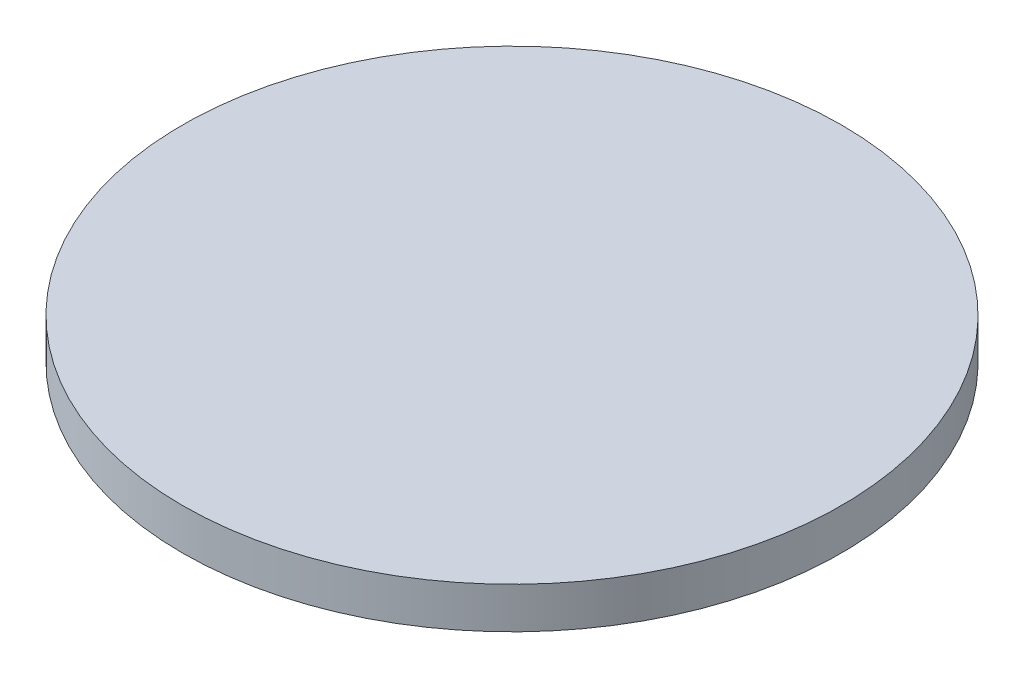
ISO-10303-21;
HEADER;
FILE_DESCRIPTION(('STEP AP214'),'2;1');
FILE_NAME('part.step','',(''),(''),'','','');
FILE_SCHEMA(('AUTOMOTIVE_DESIGN { 1 0 10303 214 1 1 1 1 }'));
ENDSEC;
DATA;
#1=APPLICATION_CONTEXT('core data for automotive mechanical design processes');
#2=APPLICATION_PROTOCOL_DEFINITION('international standard','automotive_design',2000,#1);
#3=PRODUCT_CONTEXT('',#1,'mechanical');
#4=PRODUCT('Part','Part','',(#3));
#5=PRODUCT_RELATED_PRODUCT_CATEGORY('part','',(#4));
#6=PRODUCT_DEFINITION_FORMATION('','',#4);
#7=PRODUCT_DEFINITION_CONTEXT('part definition',#1,'design');
#8=PRODUCT_DEFINITION('design','',#6,#7);
#9=PRODUCT_DEFINITION_SHAPE('','',#8);
#10=(LENGTH_UNIT() NAMED_UNIT(*) SI_UNIT(.MILLI.,.METRE.));
#11=(NAMED_UNIT(*) PLANE_ANGLE_UNIT() SI_UNIT($,.RADIAN.));
#12=(NAMED_UNIT(*) SI_UNIT($,.STERADIAN.) SOLID_ANGLE_UNIT());
#13=UNCERTAINTY_MEASURE_WITH_UNIT(LENGTH_MEASURE(1.E-05),#10,'distance_accuracy_value','');
#14=(GEOMETRIC_REPRESENTATION_CONTEXT(3) GLOBAL_UNCERTAINTY_ASSIGNED_CONTEXT((#13)) GLOBAL_UNIT_ASSIGNED_CONTEXT((#10,
#11,#12)) REPRESENTATION_CONTEXT('',''));
#15=CARTESIAN_POINT('',(0.,0.,0.));
#16=DIRECTION('',(0.,0.,1.));
#17=DIRECTION('',(1.,0.,0.));
#18=AXIS2_PLACEMENT_3D('',#15,#16,#17);
#19=CARTESIAN_POINT('',(0.,1.,0.));
#20=DIRECTION('',(0.,-1.,0.));
#21=DIRECTION('',(0.,0.,-1.));
#22=AXIS2_PLACEMENT_3D('',#19,#20,#21);
#23=CYLINDRICAL_SURFACE('',#22,8.);
#24=CARTESIAN_POINT('',(0.,1.,0.));
#25=DIRECTION('',(0.,1.,0.));
#26=DIRECTION('',(0.,0.,1.));
#27=AXIS2_PLACEMENT_3D('',#24,#25,#26);
#28=CIRCLE('',#27,8.);
#29=CARTESIAN_POINT('',(0.,1.,8.));
#30=VERTEX_POINT('',#29);
#31=EDGE_CURVE('E10',#30,#30,#28,.T.);
#32=ORIENTED_EDGE('',*,*,#31,.F.);
#33=EDGE_LOOP('',(#32));
#34=FACE_BOUND('',#33,.T.);
#35=CARTESIAN_POINT('',(0.,0.,0.));
#36=DIRECTION('',(0.,1.,0.));
#37=DIRECTION('',(0.,0.,1.));
#38=AXIS2_PLACEMENT_3D('',#35,#36,#37);
#39=CIRCLE('',#38,8.);
#40=CARTESIAN_POINT('',(0.,0.,8.));
#41=VERTEX_POINT('',#40);
#42=EDGE_CURVE('E37',#41,#41,#39,.T.);
#43=ORIENTED_EDGE('',*,*,#42,.T.);
#44=EDGE_LOOP('',(#43));
#45=FACE_BOUND('',#44,.T.);
#46=ADVANCED_FACE('F34',(#34,#45),#23,.T.);
#47=CARTESIAN_POINT('',(0.,1.,0.));
#48=DIRECTION('',(0.,1.,0.));
#49=DIRECTION('',(0.,0.,1.));
#50=AXIS2_PLACEMENT_3D('',#47,#48,#49);
#51=PLANE('',#50);
#52=ORIENTED_EDGE('',*,*,#31,.T.);
#53=EDGE_LOOP('',(#52));
#54=FACE_BOUND('',#53,.T.);
#55=ADVANCED_FACE('F49',(#54),#51,.T.);
#56=CARTESIAN_POINT('',(0.,0.,0.));
#57=DIRECTION('',(0.,1.,0.));
#58=DIRECTION('',(0.,0.,1.));
#59=AXIS2_PLACEMENT_3D('',#56,#57,#58);
#60=PLANE('',#59);
#61=ORIENTED_EDGE('',*,*,#42,.F.);
#62=EDGE_LOOP('',(#61));
#63=FACE_BOUND('',#62,.T.);
#64=ADVANCED_FACE('F47',(#63),#60,.F.);
#65=CLOSED_SHELL('',(#46,#55,#64));
#66=MANIFOLD_SOLID_BREP('B2',#65);
#67=ADVANCED_BREP_SHAPE_REPRESENTATION('',(#18,#66),#14);
#68=SHAPE_DEFINITION_REPRESENTATION(#9,#67);
ENDSEC;
END-ISO-10303-21;
